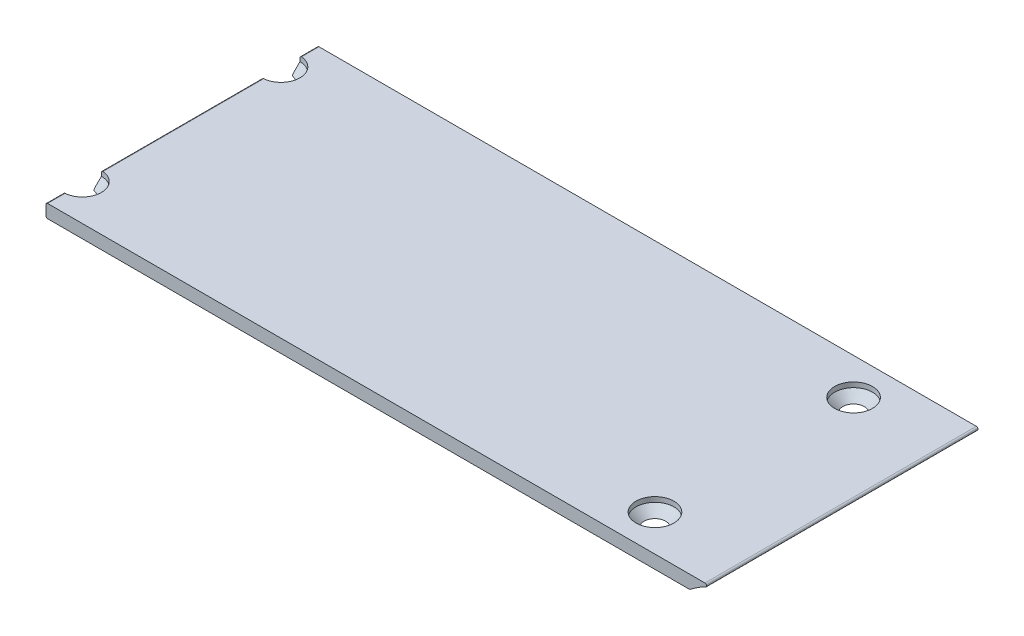
ISO-10303-21;
HEADER;
FILE_DESCRIPTION(('STEP AP214'),'2;1');
FILE_NAME('part.step','',(''),(''),'','','');
FILE_SCHEMA(('AUTOMOTIVE_DESIGN { 1 0 10303 214 1 1 1 1 }'));
ENDSEC;
DATA;
#1=APPLICATION_CONTEXT('core data for automotive mechanical design processes');
#2=APPLICATION_PROTOCOL_DEFINITION('international standard','automotive_design',2000,#1);
#3=PRODUCT_CONTEXT('',#1,'mechanical');
#4=PRODUCT('Part','Part','',(#3));
#5=PRODUCT_RELATED_PRODUCT_CATEGORY('part','',(#4));
#6=PRODUCT_DEFINITION_FORMATION('','',#4);
#7=PRODUCT_DEFINITION_CONTEXT('part definition',#1,'design');
#8=PRODUCT_DEFINITION('design','',#6,#7);
#9=PRODUCT_DEFINITION_SHAPE('','',#8);
#10=(LENGTH_UNIT() NAMED_UNIT(*) SI_UNIT(.MILLI.,.METRE.));
#11=(NAMED_UNIT(*) PLANE_ANGLE_UNIT() SI_UNIT($,.RADIAN.));
#12=(NAMED_UNIT(*) SI_UNIT($,.STERADIAN.) SOLID_ANGLE_UNIT());
#13=UNCERTAINTY_MEASURE_WITH_UNIT(LENGTH_MEASURE(1.E-05),#10,'distance_accuracy_value','');
#14=(GEOMETRIC_REPRESENTATION_CONTEXT(3) GLOBAL_UNCERTAINTY_ASSIGNED_CONTEXT((#13)) GLOBAL_UNIT_ASSIGNED_CONTEXT((#10,
#11,#12)) REPRESENTATION_CONTEXT('',''));
#15=CARTESIAN_POINT('',(0.,0.,0.));
#16=DIRECTION('',(0.,0.,1.));
#17=DIRECTION('',(1.,0.,0.));
#18=AXIS2_PLACEMENT_3D('',#15,#16,#17);
#19=CARTESIAN_POINT('',(225.,23.,-49.5));
#20=DIRECTION('',(-1.,0.,0.));
#21=DIRECTION('',(0.,0.,1.));
#22=AXIS2_PLACEMENT_3D('',#19,#20,#21);
#23=PLANE('',#22);
#24=DIRECTION('',(0.,0.707106781186548,0.707106781186547));
#25=VECTOR('',#24,1.);
#26=CARTESIAN_POINT('',(225.,15.765,-19.5));
#27=LINE('',#26,#25);
#28=CARTESIAN_POINT('',(225.,19.4999999999993,-15.7650000000002));
#29=VERTEX_POINT('',#28);
#30=CARTESIAN_POINT('',(225.,21.5,-13.765));
#31=VERTEX_POINT('',#30);
#32=EDGE_CURVE('E318',#29,#31,#27,.T.);
#33=ORIENTED_EDGE('',*,*,#32,.F.);
#34=DIRECTION('',(0.,0.,1.));
#35=VECTOR('',#34,1.);
#36=CARTESIAN_POINT('',(225.,19.4999999999996,-49.5));
#37=LINE('',#36,#35);
#38=CARTESIAN_POINT('',(225.,19.4999999999996,-8.5));
#39=VERTEX_POINT('',#38);
#40=EDGE_CURVE('E376',#29,#39,#37,.T.);
#41=ORIENTED_EDGE('',*,*,#40,.T.);
#42=DIRECTION('',(0.,-1.,0.));
#43=VECTOR('',#42,1.);
#44=CARTESIAN_POINT('',(225.,23.,-8.5));
#45=LINE('',#44,#43);
#46=CARTESIAN_POINT('',(225.,22.5,-8.5));
#47=VERTEX_POINT('',#46);
#48=EDGE_CURVE('E351',#47,#39,#45,.T.);
#49=ORIENTED_EDGE('',*,*,#48,.F.);
#50=DIRECTION('',(0.,0.,1.));
#51=VECTOR('',#50,1.);
#52=CARTESIAN_POINT('',(225.,22.5,-49.5));
#53=LINE('',#52,#51);
#54=CARTESIAN_POINT('',(225.,22.5,-13.765));
#55=VERTEX_POINT('',#54);
#56=EDGE_CURVE('E379',#47,#55,#53,.F.);
#57=ORIENTED_EDGE('',*,*,#56,.T.);
#58=DIRECTION('',(0.,1.,0.));
#59=VECTOR('',#58,1.);
#60=CARTESIAN_POINT('',(225.,23.,-13.765));
#61=LINE('',#60,#59);
#62=EDGE_CURVE('E349',#31,#55,#61,.T.);
#63=ORIENTED_EDGE('',*,*,#62,.F.);
#64=EDGE_LOOP('',(#33,#41,#49,#57,#63));
#65=FACE_BOUND('',#64,.T.);
#66=ADVANCED_FACE('F39',(#65),#23,.T.);
#67=CARTESIAN_POINT('',(225.5,22.5,-49.5));
#68=DIRECTION('',(0.,0.,1.));
#69=DIRECTION('',(1.,0.,0.));
#70=AXIS2_PLACEMENT_3D('',#67,#68,#69);
#71=CYLINDRICAL_SURFACE('',#70,0.5);
#72=CARTESIAN_POINT('',(225.,22.5,-13.765));
#73=CARTESIAN_POINT('',(224.999976111889,22.5281270241259,-13.7650058933718));
#74=CARTESIAN_POINT('',(225.002371960446,22.556246933712,-13.7650000985351));
#75=CARTESIAN_POINT('',(225.011826932998,22.6116702744218,-13.7650086911855));
#76=CARTESIAN_POINT('',(225.018882460735,22.6389743182435,-13.7650230631178));
#77=CARTESIAN_POINT('',(225.03748559768,22.6920222990551,-13.7651154452753));
#78=CARTESIAN_POINT('',(225.049035381988,22.7177654736426,-13.7651934863348));
#79=CARTESIAN_POINT('',(225.076288829427,22.7669429593841,-13.7654911959646));
#80=CARTESIAN_POINT('',(225.091991765805,22.7903776735078,-13.7657108397658));
#81=CARTESIAN_POINT('',(225.127101175343,22.8342695592799,-13.7663818409362));
#82=CARTESIAN_POINT('',(225.146506433251,22.8547277040867,-13.7668331223544));
#83=CARTESIAN_POINT('',(225.188472933217,22.8920972800601,-13.7680594283539));
#84=CARTESIAN_POINT('',(225.211034691092,22.9090081304163,-13.7688345058893));
#85=CARTESIAN_POINT('',(225.258632974092,22.9387817108491,-13.7707853832107));
#86=CARTESIAN_POINT('',(225.283666630535,22.9516490625717,-13.7719607222782));
#87=CARTESIAN_POINT('',(225.335509264018,22.9729984387523,-13.7747637106296));
#88=CARTESIAN_POINT('',(225.362317286307,22.9814828003144,-13.7763911181476));
#89=CARTESIAN_POINT('',(225.407737733062,22.9917659002081,-13.779483792947));
#90=CARTESIAN_POINT('',(225.426077913602,22.994853101934,-13.7808198640753));
#91=CARTESIAN_POINT('',(225.462945725978,22.9989699440721,-13.7836855266412));
#92=CARTESIAN_POINT('',(225.481473047125,23.000002564215,-13.7852148343995));
#93=CARTESIAN_POINT('',(225.5,23.,-13.786837565761));
#94=B_SPLINE_CURVE_WITH_KNOTS('',3,(#72,#73,#74,#75,#76,#77,#78,#79,#80,#81,#82,#83,#84,#85,#86,
#87,#88,#89,#90,#91,#92,#93),.UNSPECIFIED.,.F.,.F.,(4,2,2,2,2,2,2,2,2,2,4),(0.,
0.0842690311517414,0.168473100829007,0.252717973809997,0.336948114676777,0.421150655196376,
0.5053669717384,0.589486677461794,0.673561482340993,0.729391894278504,0.785141276964552),.UNSPECIFIED.);
#95=CARTESIAN_POINT('',(225.5,23.,-13.786837565761));
#96=VERTEX_POINT('',#95);
#97=EDGE_CURVE('E343',#55,#96,#94,.T.);
#98=ORIENTED_EDGE('',*,*,#97,.F.);
#99=ORIENTED_EDGE('',*,*,#56,.F.);
#100=CARTESIAN_POINT('',(225.5,22.5,-8.5));
#101=DIRECTION('',(0.,0.,1.));
#102=DIRECTION('',(1.,0.,0.));
#103=AXIS2_PLACEMENT_3D('',#100,#101,#102);
#104=CIRCLE('',#103,0.5);
#105=CARTESIAN_POINT('',(225.5,23.,-8.5));
#106=VERTEX_POINT('',#105);
#107=EDGE_CURVE('E374',#106,#47,#104,.T.);
#108=ORIENTED_EDGE('',*,*,#107,.F.);
#109=DIRECTION('',(0.,0.,1.));
#110=VECTOR('',#109,1.);
#111=CARTESIAN_POINT('',(225.5,23.,-49.5));
#112=LINE('',#111,#110);
#113=EDGE_CURVE('E365',#96,#106,#112,.T.);
#114=ORIENTED_EDGE('',*,*,#113,.F.);
#115=EDGE_LOOP('',(#98,#99,#108,#114));
#116=FACE_BOUND('',#115,.T.);
#117=ADVANCED_FACE('F281',(#116),#71,.T.);
#118=CARTESIAN_POINT('',(225.5,19.4999999999996,-49.5));
#119=DIRECTION('',(0.,0.,1.));
#120=DIRECTION('',(1.,0.,0.));
#121=AXIS2_PLACEMENT_3D('',#118,#119,#120);
#122=CYLINDRICAL_SURFACE('',#121,0.5);
#123=CARTESIAN_POINT('',(225.002526422812,19.5501999999996,-23.285199156872));
#124=CARTESIAN_POINT('',(225.000564653077,19.5306837247009,-23.2656828056493));
#125=CARTESIAN_POINT('',(224.999743406715,19.5111223870039,-23.2461222284875));
#126=CARTESIAN_POINT('',(225.000398976851,19.4720030494911,-23.2070032070346));
#127=CARTESIAN_POINT('',(225.001877756651,19.4524450667949,-23.1874447788333));
#128=CARTESIAN_POINT('',(225.009825989489,19.3937144747553,-23.1287066790372));
#129=CARTESIAN_POINT('',(225.019833415117,19.354741026895,-23.0897199236154));
#130=CARTESIAN_POINT('',(225.046432568021,19.2871812312316,-23.0218946279302));
#131=CARTESIAN_POINT('',(225.061108363734,19.2581856697311,-22.9926996941433));
#132=CARTESIAN_POINT('',(225.096805786974,19.2024707982455,-22.93615751171));
#133=CARTESIAN_POINT('',(225.11780758487,19.1757447051482,-22.908804811526));
#134=CARTESIAN_POINT('',(225.160537905986,19.1319502493724,-22.8631751857383));
#135=CARTESIAN_POINT('',(225.180848433837,19.1141135932447,-22.8443084851037));
#136=CARTESIAN_POINT('',(225.225328719884,19.0812905891293,-22.8087083521058));
#137=CARTESIAN_POINT('',(225.249495827681,19.0663022990164,-22.7919734687729));
#138=CARTESIAN_POINT('',(225.29620124717,19.0428308841404,-22.7644919913127));
#139=CARTESIAN_POINT('',(225.318074856484,19.0336448917804,-22.7532193477425));
#140=CARTESIAN_POINT('',(225.363816952495,19.0183006870287,-22.7329812121385));
#141=CARTESIAN_POINT('',(225.387680007914,19.0121345278856,-22.7240096946372));
#142=CARTESIAN_POINT('',(225.434383705236,19.0038197606829,-22.7096379980003));
#143=CARTESIAN_POINT('',(225.457076386205,19.0013226866008,-22.7039651027765));
#144=CARTESIAN_POINT('',(225.503243925115,18.9994647849746,-22.6951657556668));
#145=CARTESIAN_POINT('',(225.52672339428,19.0001277735784,-22.6920588487729));
#146=CARTESIAN_POINT('',(225.5502,19.0025264228118,-22.6904321491617));
#147=B_SPLINE_CURVE_WITH_KNOTS('',3,(#123,#124,#125,#126,#127,#128,#129,#130,#131,#132,#133,
#134,#135,#136,#137,#138,#139,#140,#141,#142,#143,#144,#145,#146),.UNSPECIFIED.,.F.,.F.,(4,2,2,
2,2,2,2,2,2,2,2,4),(0.,0.0829495843265982,0.165970013303469,0.333085915997442,0.463694854194704,
0.593898569508003,0.692447709658665,0.790929412223857,0.869426002124149,0.947714901650061,
1.01793790593085,1.0886909865257),.UNSPECIFIED.);
#148=CARTESIAN_POINT('',(224.999999999999,19.4999999999996,-23.2349999999996));
#149=VERTEX_POINT('',#148);
#150=CARTESIAN_POINT('',(225.5,18.9999999999996,-22.6961265619492));
#151=VERTEX_POINT('',#150);
#152=EDGE_CURVE('E11',#149,#151,#147,.T.);
#153=ORIENTED_EDGE('',*,*,#152,.F.);
#154=CARTESIAN_POINT('',(224.999999999999,19.4999999999996,-75.7650000000004));
#155=VERTEX_POINT('',#154);
#156=EDGE_CURVE('E314',#155,#149,#37,.T.);
#157=ORIENTED_EDGE('',*,*,#156,.F.);
#158=CARTESIAN_POINT('',(225.002526422812,19.5501999999996,-75.714800843128));
#159=CARTESIAN_POINT('',(225.000564653077,19.5306837247009,-75.7343171943507));
#160=CARTESIAN_POINT('',(224.999743406715,19.5111223870039,-75.7538777715125));
#161=CARTESIAN_POINT('',(225.000398976851,19.4720030494911,-75.7929967929654));
#162=CARTESIAN_POINT('',(225.001877756651,19.4524450667949,-75.8125552211667));
#163=CARTESIAN_POINT('',(225.009825989489,19.3937144747553,-75.8712933209628));
#164=CARTESIAN_POINT('',(225.019833415117,19.354741026895,-75.9102800763846));
#165=CARTESIAN_POINT('',(225.046432568021,19.2871812312316,-75.9781053720698));
#166=CARTESIAN_POINT('',(225.061108363734,19.2581856697311,-76.0073003058567));
#167=CARTESIAN_POINT('',(225.096805786974,19.2024707982455,-76.06384248829));
#168=CARTESIAN_POINT('',(225.11780758487,19.1757447051482,-76.091195188474));
#169=CARTESIAN_POINT('',(225.160537905986,19.1319502493724,-76.1368248142617));
#170=CARTESIAN_POINT('',(225.180848433837,19.1141135932447,-76.1556915148963));
#171=CARTESIAN_POINT('',(225.225328719884,19.0812905891293,-76.1912916478942));
#172=CARTESIAN_POINT('',(225.249495827681,19.0663022990164,-76.2080265312271));
#173=CARTESIAN_POINT('',(225.29620124717,19.0428308841404,-76.2355080086873));
#174=CARTESIAN_POINT('',(225.318074856484,19.0336448917804,-76.2467806522575));
#175=CARTESIAN_POINT('',(225.363816952495,19.0183006870287,-76.2670187878615));
#176=CARTESIAN_POINT('',(225.387680007914,19.0121345278856,-76.2759903053628));
#177=CARTESIAN_POINT('',(225.434383705236,19.0038197606829,-76.2903620019998));
#178=CARTESIAN_POINT('',(225.457076386205,19.0013226866008,-76.2960348972235));
#179=CARTESIAN_POINT('',(225.503243925115,18.9994647849746,-76.3048342443332));
#180=CARTESIAN_POINT('',(225.52672339428,19.0001277735784,-76.3079411512271));
#181=CARTESIAN_POINT('',(225.5502,19.0025264228118,-76.3095678508383));
#182=B_SPLINE_CURVE_WITH_KNOTS('',3,(#158,#159,#160,#161,#162,#163,#164,#165,#166,#167,#168,
#169,#170,#171,#172,#173,#174,#175,#176,#177,#178,#179,#180,#181),.UNSPECIFIED.,.F.,.F.,(4,2,2,
2,2,2,2,2,2,2,2,4),(0.,0.0829495843265958,0.165970013303472,0.33308591599744,0.463694854194704,
0.593898569508001,0.692447709658643,0.790929412223859,0.869426002124153,0.947714901650063,
1.01793790593085,1.0886909865257),.UNSPECIFIED.);
#183=CARTESIAN_POINT('',(225.5,18.9999999999996,-76.3038734380508));
#184=VERTEX_POINT('',#183);
#185=EDGE_CURVE('E264',#155,#184,#182,.T.);
#186=ORIENTED_EDGE('',*,*,#185,.T.);
#187=DIRECTION('',(0.,0.,1.));
#188=VECTOR('',#187,1.);
#189=CARTESIAN_POINT('',(225.5,18.9999999999996,-49.5));
#190=LINE('',#189,#188);
#191=EDGE_CURVE('E386',#151,#184,#190,.F.);
#192=ORIENTED_EDGE('',*,*,#191,.F.);
#193=EDGE_LOOP('',(#153,#157,#186,#192));
#194=FACE_BOUND('',#193,.T.);
#195=ADVANCED_FACE('F291',(#194),#122,.T.);
#196=DIRECTION('',(0.,-0.707106781186548,0.707106781186547));
#197=VECTOR('',#196,1.);
#198=CARTESIAN_POINT('',(225.,15.765,-19.5));
#199=LINE('',#198,#197);
#200=CARTESIAN_POINT('',(225.,21.5,-25.235));
#201=VERTEX_POINT('',#200);
#202=EDGE_CURVE('E311',#201,#149,#199,.T.);
#203=ORIENTED_EDGE('',*,*,#202,.F.);
#204=DIRECTION('',(0.,1.,0.));
#205=VECTOR('',#204,1.);
#206=CARTESIAN_POINT('',(225.,23.,-25.235));
#207=LINE('',#206,#205);
#208=CARTESIAN_POINT('',(225.,22.5,-25.235));
#209=VERTEX_POINT('',#208);
#210=EDGE_CURVE('E312',#209,#201,#207,.F.);
#211=ORIENTED_EDGE('',*,*,#210,.F.);
#212=CARTESIAN_POINT('',(225.,22.5,-73.765));
#213=VERTEX_POINT('',#212);
#214=EDGE_CURVE('E378',#209,#213,#53,.F.);
#215=ORIENTED_EDGE('',*,*,#214,.T.);
#216=DIRECTION('',(0.,1.,0.));
#217=VECTOR('',#216,1.);
#218=CARTESIAN_POINT('',(225.,23.,-73.765));
#219=LINE('',#218,#217);
#220=CARTESIAN_POINT('',(225.,21.5,-73.765));
#221=VERTEX_POINT('',#220);
#222=EDGE_CURVE('E208',#213,#221,#219,.F.);
#223=ORIENTED_EDGE('',*,*,#222,.T.);
#224=DIRECTION('',(0.,-0.707106781186548,-0.707106781186547));
#225=VECTOR('',#224,1.);
#226=CARTESIAN_POINT('',(225.,15.765,-79.5));
#227=LINE('',#226,#225);
#228=EDGE_CURVE('E172',#221,#155,#227,.T.);
#229=ORIENTED_EDGE('',*,*,#228,.T.);
#230=ORIENTED_EDGE('',*,*,#156,.T.);
#231=EDGE_LOOP('',(#203,#211,#215,#223,#229,#230));
#232=FACE_BOUND('',#231,.T.);
#233=ADVANCED_FACE('F284',(#232),#23,.T.);
#234=CARTESIAN_POINT('',(225.,23.,-49.5));
#235=DIRECTION('',(0.,1.,0.));
#236=DIRECTION('',(-1.,0.,0.));
#237=AXIS2_PLACEMENT_3D('',#234,#235,#236);
#238=PLANE('',#237);
#239=CARTESIAN_POINT('',(398.,23.,-19.5));
#240=DIRECTION('',(0.,1.,0.));
#241=DIRECTION('',(0.,0.,1.));
#242=AXIS2_PLACEMENT_3D('',#239,#240,#241);
#243=CIRCLE('',#242,5.73499999999999);
#244=CARTESIAN_POINT('',(398.,23.,-13.765));
#245=VERTEX_POINT('',#244);
#246=EDGE_CURVE('E430',#245,#245,#243,.T.);
#247=ORIENTED_EDGE('',*,*,#246,.F.);
#248=EDGE_LOOP('',(#247));
#249=FACE_BOUND('',#248,.T.);
#250=CARTESIAN_POINT('',(225.,23.,-19.5));
#251=DIRECTION('',(0.,1.,0.));
#252=DIRECTION('',(0.,0.,1.));
#253=AXIS2_PLACEMENT_3D('',#250,#251,#252);
#254=CIRCLE('',#253,5.73499999999999);
#255=CARTESIAN_POINT('',(225.5,23.,-25.213162434239));
#256=VERTEX_POINT('',#255);
#257=EDGE_CURVE('E416',#96,#256,#254,.T.);
#258=ORIENTED_EDGE('',*,*,#257,.F.);
#259=ORIENTED_EDGE('',*,*,#113,.T.);
#260=DIRECTION('',(-1.,0.,0.));
#261=VECTOR('',#260,1.);
#262=CARTESIAN_POINT('',(225.,23.,-8.5));
#263=LINE('',#262,#261);
#264=CARTESIAN_POINT('',(424.102752641149,23.0000000000001,-8.5));
#265=VERTEX_POINT('',#264);
#266=EDGE_CURVE('E360',#265,#106,#263,.T.);
#267=ORIENTED_EDGE('',*,*,#266,.F.);
#268=DIRECTION('',(0.,0.,1.));
#269=VECTOR('',#268,1.);
#270=CARTESIAN_POINT('',(424.102752641149,23.0000000000001,-49.5));
#271=LINE('',#270,#269);
#272=CARTESIAN_POINT('',(424.102752641149,23.0000000000001,-90.5));
#273=VERTEX_POINT('',#272);
#274=EDGE_CURVE('E363',#265,#273,#271,.F.);
#275=ORIENTED_EDGE('',*,*,#274,.T.);
#276=DIRECTION('',(-1.,0.,0.));
#277=VECTOR('',#276,1.);
#278=CARTESIAN_POINT('',(225.,23.,-90.5));
#279=LINE('',#278,#277);
#280=CARTESIAN_POINT('',(225.5,23.,-90.5));
#281=VERTEX_POINT('',#280);
#282=EDGE_CURVE('E237',#273,#281,#279,.T.);
#283=ORIENTED_EDGE('',*,*,#282,.T.);
#284=DIRECTION('',(0.,0.,-1.));
#285=VECTOR('',#284,1.);
#286=CARTESIAN_POINT('',(225.5,23.,-49.5));
#287=LINE('',#286,#285);
#288=CARTESIAN_POINT('',(225.5,23.,-85.213162434239));
#289=VERTEX_POINT('',#288);
#290=EDGE_CURVE('E239',#289,#281,#287,.T.);
#291=ORIENTED_EDGE('',*,*,#290,.F.);
#292=CARTESIAN_POINT('',(225.,23.,-79.5));
#293=DIRECTION('',(0.,-1.,0.));
#294=DIRECTION('',(0.,0.,-1.));
#295=AXIS2_PLACEMENT_3D('',#292,#293,#294);
#296=CIRCLE('',#295,5.73499999999999);
#297=CARTESIAN_POINT('',(225.5,23.,-73.786837565761));
#298=VERTEX_POINT('',#297);
#299=EDGE_CURVE('E177',#289,#298,#296,.T.);
#300=ORIENTED_EDGE('',*,*,#299,.T.);
#301=EDGE_CURVE('E366',#298,#256,#112,.T.);
#302=ORIENTED_EDGE('',*,*,#301,.T.);
#303=EDGE_LOOP('',(#258,#259,#267,#275,#283,#291,#300,#302));
#304=FACE_BOUND('',#303,.T.);
#305=CARTESIAN_POINT('',(398.,23.,-79.5));
#306=DIRECTION('',(0.,-1.,0.));
#307=DIRECTION('',(0.,0.,-1.));
#308=AXIS2_PLACEMENT_3D('',#305,#306,#307);
#309=CIRCLE('',#308,5.73499999999999);
#310=CARTESIAN_POINT('',(398.,23.,-85.235));
#311=VERTEX_POINT('',#310);
#312=EDGE_CURVE('E439',#311,#311,#309,.T.);
#313=ORIENTED_EDGE('',*,*,#312,.T.);
#314=EDGE_LOOP('',(#313));
#315=FACE_BOUND('',#314,.T.);
#316=ADVANCED_FACE('F298',(#249,#304,#315),#238,.T.);
#317=CARTESIAN_POINT('',(435.,0.,-49.5));
#318=DIRECTION('',(0.,0.,1.));
#319=DIRECTION('',(1.,0.,0.));
#320=AXIS2_PLACEMENT_3D('',#317,#318,#319);
#321=CYLINDRICAL_SURFACE('',#320,24.5);
#322=DIRECTION('',(0.,0.,1.));
#323=VECTOR('',#322,1.);
#324=CARTESIAN_POINT('',(419.668401909782,19.11,-49.5));
#325=LINE('',#324,#323);
#326=CARTESIAN_POINT('',(419.668401909782,19.11,-8.5));
#327=VERTEX_POINT('',#326);
#328=CARTESIAN_POINT('',(419.668401909782,19.11,-90.5));
#329=VERTEX_POINT('',#328);
#330=EDGE_CURVE('E382',#327,#329,#325,.F.);
#331=ORIENTED_EDGE('',*,*,#330,.T.);
#332=CARTESIAN_POINT('',(435.,0.,-90.5));
#333=DIRECTION('',(0.,0.,-1.));
#334=DIRECTION('',(1.,0.,0.));
#335=AXIS2_PLACEMENT_3D('',#332,#333,#334);
#336=CIRCLE('',#335,24.5);
#337=CARTESIAN_POINT('',(424.320697588326,22.0500000000001,-90.5));
#338=VERTEX_POINT('',#337);
#339=EDGE_CURVE('E234',#329,#338,#336,.T.);
#340=ORIENTED_EDGE('',*,*,#339,.T.);
#341=DIRECTION('',(0.,0.,1.));
#342=VECTOR('',#341,1.);
#343=CARTESIAN_POINT('',(424.320697588326,22.0500000000001,-49.5));
#344=LINE('',#343,#342);
#345=CARTESIAN_POINT('',(424.320697588326,22.0500000000001,-8.5));
#346=VERTEX_POINT('',#345);
#347=EDGE_CURVE('E384',#338,#346,#344,.T.);
#348=ORIENTED_EDGE('',*,*,#347,.T.);
#349=CARTESIAN_POINT('',(435.,0.,-8.5));
#350=DIRECTION('',(0.,0.,-1.));
#351=DIRECTION('',(1.,0.,0.));
#352=AXIS2_PLACEMENT_3D('',#349,#350,#351);
#353=CIRCLE('',#352,24.5);
#354=EDGE_CURVE('E357',#327,#346,#353,.T.);
#355=ORIENTED_EDGE('',*,*,#354,.F.);
#356=EDGE_LOOP('',(#331,#340,#348,#355));
#357=FACE_BOUND('',#356,.T.);
#358=ADVANCED_FACE('F304',(#357),#321,.F.);
#359=CARTESIAN_POINT('',(419.532291701742,19.,-49.5));
#360=DIRECTION('',(0.,-1.,0.));
#361=DIRECTION('',(1.,0.,0.));
#362=AXIS2_PLACEMENT_3D('',#359,#360,#361);
#363=PLANE('',#362);
#364=CARTESIAN_POINT('',(398.,19.,-19.5));
#365=DIRECTION('',(0.,-1.,0.));
#366=DIRECTION('',(1.,0.,0.));
#367=AXIS2_PLACEMENT_3D('',#364,#365,#366);
#368=CIRCLE('',#367,3.23499999999994);
#369=CARTESIAN_POINT('',(401.235,19.,-19.5));
#370=VERTEX_POINT('',#369);
#371=EDGE_CURVE('E44',#370,#370,#368,.T.);
#372=ORIENTED_EDGE('',*,*,#371,.F.);
#373=EDGE_LOOP('',(#372));
#374=FACE_BOUND('',#373,.T.);
#375=CARTESIAN_POINT('',(225.,18.9999999999996,-19.5));
#376=DIRECTION('',(0.,-1.,0.));
#377=DIRECTION('',(1.,0.,0.));
#378=AXIS2_PLACEMENT_3D('',#375,#376,#377);
#379=CIRCLE('',#378,3.23499999999957);
#380=CARTESIAN_POINT('',(225.5,18.9999999999996,-16.3038734380508));
#381=VERTEX_POINT('',#380);
#382=EDGE_CURVE('E55',#151,#381,#379,.T.);
#383=ORIENTED_EDGE('',*,*,#382,.F.);
#384=ORIENTED_EDGE('',*,*,#191,.T.);
#385=CARTESIAN_POINT('',(225.,18.9999999999996,-79.5));
#386=DIRECTION('',(0.,1.,0.));
#387=DIRECTION('',(1.,0.,0.));
#388=AXIS2_PLACEMENT_3D('',#385,#386,#387);
#389=CIRCLE('',#388,3.23499999999957);
#390=CARTESIAN_POINT('',(225.5,18.9999999999996,-82.6961265619492));
#391=VERTEX_POINT('',#390);
#392=EDGE_CURVE('E176',#184,#391,#389,.T.);
#393=ORIENTED_EDGE('',*,*,#392,.T.);
#394=DIRECTION('',(0.,0.,-1.));
#395=VECTOR('',#394,1.);
#396=CARTESIAN_POINT('',(225.5,18.9999999999996,-49.5));
#397=LINE('',#396,#395);
#398=CARTESIAN_POINT('',(225.5,18.9999999999996,-90.5));
#399=VERTEX_POINT('',#398);
#400=EDGE_CURVE('E255',#399,#391,#397,.F.);
#401=ORIENTED_EDGE('',*,*,#400,.F.);
#402=DIRECTION('',(1.,0.,0.));
#403=VECTOR('',#402,1.);
#404=CARTESIAN_POINT('',(419.532291701742,19.,-90.5));
#405=LINE('',#404,#403);
#406=CARTESIAN_POINT('',(419.355512152838,19.,-90.5));
#407=VERTEX_POINT('',#406);
#408=EDGE_CURVE('E231',#399,#407,#405,.T.);
#409=ORIENTED_EDGE('',*,*,#408,.T.);
#410=DIRECTION('',(0.,0.,1.));
#411=VECTOR('',#410,1.);
#412=CARTESIAN_POINT('',(419.355512152838,19.,-49.5));
#413=LINE('',#412,#411);
#414=CARTESIAN_POINT('',(419.355512152838,19.,-8.5));
#415=VERTEX_POINT('',#414);
#416=EDGE_CURVE('E390',#407,#415,#413,.T.);
#417=ORIENTED_EDGE('',*,*,#416,.T.);
#418=DIRECTION('',(1.,0.,0.));
#419=VECTOR('',#418,1.);
#420=CARTESIAN_POINT('',(419.532291701742,19.,-8.5));
#421=LINE('',#420,#419);
#422=CARTESIAN_POINT('',(225.5,18.9999999999996,-8.5));
#423=VERTEX_POINT('',#422);
#424=EDGE_CURVE('E354',#423,#415,#421,.T.);
#425=ORIENTED_EDGE('',*,*,#424,.F.);
#426=EDGE_CURVE('E387',#423,#381,#190,.F.);
#427=ORIENTED_EDGE('',*,*,#426,.T.);
#428=EDGE_LOOP('',(#383,#384,#393,#401,#409,#417,#425,#427));
#429=FACE_BOUND('',#428,.T.);
#430=CARTESIAN_POINT('',(398.,19.,-79.5));
#431=DIRECTION('',(0.,1.,0.));
#432=DIRECTION('',(1.,0.,0.));
#433=AXIS2_PLACEMENT_3D('',#430,#431,#432);
#434=CIRCLE('',#433,3.23499999999994);
#435=CARTESIAN_POINT('',(401.235,19.,-79.5));
#436=VERTEX_POINT('',#435);
#437=EDGE_CURVE('E432',#436,#436,#434,.T.);
#438=ORIENTED_EDGE('',*,*,#437,.T.);
#439=EDGE_LOOP('',(#438));
#440=FACE_BOUND('',#439,.T.);
#441=ADVANCED_FACE('F526',(#374,#429,#440),#363,.T.);
#442=CARTESIAN_POINT('',(435.,0.,-8.5));
#443=DIRECTION('',(0.,0.,1.));
#444=DIRECTION('',(1.,0.,0.));
#445=AXIS2_PLACEMENT_3D('',#442,#443,#444);
#446=PLANE('',#445);
#447=ORIENTED_EDGE('',*,*,#266,.T.);
#448=ORIENTED_EDGE('',*,*,#107,.T.);
#449=ORIENTED_EDGE('',*,*,#48,.T.);
#450=CARTESIAN_POINT('',(225.5,19.4999999999996,-8.5));
#451=DIRECTION('',(0.,0.,1.));
#452=DIRECTION('',(1.,0.,0.));
#453=AXIS2_PLACEMENT_3D('',#450,#451,#452);
#454=CIRCLE('',#453,0.5);
#455=EDGE_CURVE('E369',#39,#423,#454,.T.);
#456=ORIENTED_EDGE('',*,*,#455,.T.);
#457=ORIENTED_EDGE('',*,*,#424,.T.);
#458=CARTESIAN_POINT('',(419.355512152838,19.5,-8.5));
#459=DIRECTION('',(0.,0.,1.));
#460=DIRECTION('',(1.,0.,0.));
#461=AXIS2_PLACEMENT_3D('',#458,#459,#460);
#462=CIRCLE('',#461,0.5);
#463=EDGE_CURVE('E371',#415,#327,#462,.T.);
#464=ORIENTED_EDGE('',*,*,#463,.T.);
#465=ORIENTED_EDGE('',*,*,#354,.T.);
#466=CARTESIAN_POINT('',(424.102752641149,22.5,-8.5));
#467=DIRECTION('',(0.,0.,1.));
#468=DIRECTION('',(1.,0.,0.));
#469=AXIS2_PLACEMENT_3D('',#466,#467,#468);
#470=CIRCLE('',#469,0.5);
#471=EDGE_CURVE('E63',#346,#265,#470,.T.);
#472=ORIENTED_EDGE('',*,*,#471,.T.);
#473=EDGE_LOOP('',(#447,#448,#449,#456,#457,#464,#465,#472));
#474=FACE_BOUND('',#473,.T.);
#475=ADVANCED_FACE('F410',(#474),#446,.T.);
#476=CARTESIAN_POINT('',(225.5,23.,-25.213162434239));
#477=CARTESIAN_POINT('',(225.47198948981,23.0000245800375,-25.2156218282848));
#478=CARTESIAN_POINT('',(225.443964426867,22.9976475663107,-25.2178591541508));
#479=CARTESIAN_POINT('',(225.388690455363,22.9882508167163,-25.2218779882086));
#480=CARTESIAN_POINT('',(225.36144099801,22.9812344531948,-25.2236598261912));
#481=CARTESIAN_POINT('',(225.308464627873,22.9627134831437,-25.2267605355825));
#482=CARTESIAN_POINT('',(225.282738639935,22.9512061818478,-25.2280791281184));
#483=CARTESIAN_POINT('',(225.233572848711,22.9240340275891,-25.2302943363909));
#484=CARTESIAN_POINT('',(225.210132555469,22.9083700683287,-25.2311910427203));
#485=CARTESIAN_POINT('',(225.166250394567,22.8733599218072,-25.2326318742266));
#486=CARTESIAN_POINT('',(225.145802632343,22.854021150665,-25.2331766999546));
#487=CARTESIAN_POINT('',(225.108428858547,22.8121840210353,-25.2340054451725));
#488=CARTESIAN_POINT('',(225.091503589202,22.7896849983171,-25.234289309718));
#489=CARTESIAN_POINT('',(225.061645767858,22.7421457925394,-25.2346882068935));
#490=CARTESIAN_POINT('',(225.048717445474,22.7171029545515,-25.2348030611547));
#491=CARTESIAN_POINT('',(225.027249121449,22.6652087188528,-25.2349453708333));
#492=CARTESIAN_POINT('',(225.018706631516,22.6383583564402,-25.234972875854));
#493=CARTESIAN_POINT('',(225.008330507337,22.5927924927522,-25.2349954477094));
#494=CARTESIAN_POINT('',(225.005208604504,22.5743599536835,-25.2349982872587));
#495=CARTESIAN_POINT('',(225.001043516479,22.5372874926583,-25.235000009976));
#496=CARTESIAN_POINT('',(224.999997450315,22.5186478942758,-25.2349988986334));
#497=CARTESIAN_POINT('',(225.,22.5,-25.235));
#498=B_SPLINE_CURVE_WITH_KNOTS('',3,(#476,#477,#478,#479,#480,#481,#482,#483,#484,#485,#486,
#487,#488,#489,#490,#491,#492,#493,#494,#495,#496,#497),.UNSPECIFIED.,.F.,.F.,(4,2,2,2,2,2,2,2,
2,2,4),(0.,0.0842466434316219,0.168432115150683,0.252668179828577,0.336886147979862,
0.420935927415868,0.505003399183274,0.589159529979407,0.673267862067994,0.729243844277357,
0.785142085159217),.UNSPECIFIED.);
#499=EDGE_CURVE('E317',#256,#209,#498,.T.);
#500=ORIENTED_EDGE('',*,*,#499,.F.);
#501=ORIENTED_EDGE('',*,*,#301,.F.);
#502=CARTESIAN_POINT('',(225.5,23.,-73.786837565761));
#503=CARTESIAN_POINT('',(225.47198948981,23.0000245800375,-73.7843781717152));
#504=CARTESIAN_POINT('',(225.443964426867,22.9976475663107,-73.7821408458493));
#505=CARTESIAN_POINT('',(225.388690455363,22.9882508167163,-73.7781220117915));
#506=CARTESIAN_POINT('',(225.36144099801,22.9812344531948,-73.7763401738088));
#507=CARTESIAN_POINT('',(225.308464627873,22.9627134831436,-73.7732394644175));
#508=CARTESIAN_POINT('',(225.282738639935,22.9512061818478,-73.7719208718816));
#509=CARTESIAN_POINT('',(225.233572848711,22.924034027589,-73.7697056636091));
#510=CARTESIAN_POINT('',(225.210132555469,22.9083700683287,-73.7688089572797));
#511=CARTESIAN_POINT('',(225.166250394567,22.8733599218072,-73.7673681257734));
#512=CARTESIAN_POINT('',(225.145802632343,22.854021150665,-73.7668233000454));
#513=CARTESIAN_POINT('',(225.108428858547,22.8121840210353,-73.7659945548275));
#514=CARTESIAN_POINT('',(225.091503589202,22.7896849983171,-73.765710690282));
#515=CARTESIAN_POINT('',(225.061645767858,22.7421457925394,-73.7653117931064));
#516=CARTESIAN_POINT('',(225.048717445474,22.7171029545515,-73.7651969388452));
#517=CARTESIAN_POINT('',(225.027249121449,22.6652087188528,-73.7650546291668));
#518=CARTESIAN_POINT('',(225.018706631516,22.6383583564402,-73.765027124146));
#519=CARTESIAN_POINT('',(225.008330507337,22.5927924927522,-73.7650045522906));
#520=CARTESIAN_POINT('',(225.005208604504,22.5743599536835,-73.7650017127413));
#521=CARTESIAN_POINT('',(225.001043516479,22.5372874926583,-73.764999990024));
#522=CARTESIAN_POINT('',(224.999997450315,22.5186478942758,-73.7650011013666));
#523=CARTESIAN_POINT('',(225.,22.5,-73.765));
#524=B_SPLINE_CURVE_WITH_KNOTS('',3,(#502,#503,#504,#505,#506,#507,#508,#509,#510,#511,#512,
#513,#514,#515,#516,#517,#518,#519,#520,#521,#522,#523),.UNSPECIFIED.,.F.,.F.,(4,2,2,2,2,2,2,2,
2,2,4),(0.,0.0842466434316208,0.168432115150683,0.252668179828638,0.336886147979861,
0.420935927415868,0.505003399183273,0.589159529979407,0.673267862067994,0.729243844277356,
0.785142085159217),.UNSPECIFIED.);
#525=EDGE_CURVE('E195',#298,#213,#524,.T.);
#526=ORIENTED_EDGE('',*,*,#525,.T.);
#527=ORIENTED_EDGE('',*,*,#214,.F.);
#528=EDGE_LOOP('',(#500,#501,#526,#527));
#529=FACE_BOUND('',#528,.T.);
#530=ADVANCED_FACE('F294',(#529),#71,.T.);
#531=CARTESIAN_POINT('',(424.102752641149,22.5,-49.5));
#532=DIRECTION('',(0.,0.,1.));
#533=DIRECTION('',(1.,0.,0.));
#534=AXIS2_PLACEMENT_3D('',#531,#532,#533);
#535=CYLINDRICAL_SURFACE('',#534,0.5);
#536=ORIENTED_EDGE('',*,*,#347,.F.);
#537=CARTESIAN_POINT('',(424.102752641149,22.5,-90.5));
#538=DIRECTION('',(0.,0.,1.));
#539=DIRECTION('',(1.,0.,0.));
#540=AXIS2_PLACEMENT_3D('',#537,#538,#539);
#541=CIRCLE('',#540,0.5);
#542=EDGE_CURVE('E247',#338,#273,#541,.T.);
#543=ORIENTED_EDGE('',*,*,#542,.T.);
#544=ORIENTED_EDGE('',*,*,#274,.F.);
#545=ORIENTED_EDGE('',*,*,#471,.F.);
#546=EDGE_LOOP('',(#536,#543,#544,#545));
#547=FACE_BOUND('',#546,.T.);
#548=ADVANCED_FACE('F501',(#547),#535,.T.);
#549=CARTESIAN_POINT('',(419.355512152838,19.5,-49.5));
#550=DIRECTION('',(0.,0.,1.));
#551=DIRECTION('',(1.,0.,0.));
#552=AXIS2_PLACEMENT_3D('',#549,#550,#551);
#553=CYLINDRICAL_SURFACE('',#552,0.5);
#554=ORIENTED_EDGE('',*,*,#416,.F.);
#555=CARTESIAN_POINT('',(419.355512152838,19.5,-90.5));
#556=DIRECTION('',(0.,0.,1.));
#557=DIRECTION('',(1.,0.,0.));
#558=AXIS2_PLACEMENT_3D('',#555,#556,#557);
#559=CIRCLE('',#558,0.5);
#560=EDGE_CURVE('E244',#407,#329,#559,.T.);
#561=ORIENTED_EDGE('',*,*,#560,.T.);
#562=ORIENTED_EDGE('',*,*,#330,.F.);
#563=ORIENTED_EDGE('',*,*,#463,.F.);
#564=EDGE_LOOP('',(#554,#561,#562,#563));
#565=FACE_BOUND('',#564,.T.);
#566=ADVANCED_FACE('F496',(#565),#553,.T.);
#567=CARTESIAN_POINT('',(225.5502,19.0025264228118,-16.3095678508383));
#568=CARTESIAN_POINT('',(225.526087216052,19.0000597275336,-16.3078990245377));
#569=CARTESIAN_POINT('',(225.501971888189,18.9994281876423,-16.3046660735523));
#570=CARTESIAN_POINT('',(225.454600300031,19.0015151519186,-16.2954841032464));
#571=CARTESIAN_POINT('',(225.43133874508,19.0042071387777,-16.2895568183387));
#572=CARTESIAN_POINT('',(225.386210271837,19.0125779195783,-16.2753834343752));
#573=CARTESIAN_POINT('',(225.364338983462,19.0182467766418,-16.267145092057));
#574=CARTESIAN_POINT('',(225.322254430778,19.0321341870713,-16.2487237096464));
#575=CARTESIAN_POINT('',(225.302044892922,19.0403582833822,-16.2385364605355));
#576=CARTESIAN_POINT('',(225.256140789725,19.0624975246198,-16.212347327863));
#577=CARTESIAN_POINT('',(225.231329601783,19.077384734954,-16.195616725264));
#578=CARTESIAN_POINT('',(225.185640556452,19.1101645212762,-16.1599045146475));
#579=CARTESIAN_POINT('',(225.164768694517,19.1280616010908,-16.1409195460054));
#580=CARTESIAN_POINT('',(225.120972018029,19.172006279098,-16.0950422937783));
#581=CARTESIAN_POINT('',(225.099476510038,19.1988440491789,-16.067544809442));
#582=CARTESIAN_POINT('',(225.062952319362,19.2548277158212,-16.0106889720366));
#583=CARTESIAN_POINT('',(225.04793213118,19.2839765851944,-15.981328232237));
#584=CARTESIAN_POINT('',(225.023759040511,19.3442127490651,-15.9208444815341));
#585=CARTESIAN_POINT('',(225.014739143435,19.3753282367649,-15.8896971602787));
#586=CARTESIAN_POINT('',(225.002818648436,19.4381045993366,-15.8268911666289));
#587=CARTESIAN_POINT('',(224.999908727463,19.4697645688586,-15.7952333476861));
#588=CARTESIAN_POINT('',(225.000049966186,19.5176897510575,-15.7473113211899));
#589=CARTESIAN_POINT('',(225.00089338421,19.533968812791,-15.7310333139247));
#590=CARTESIAN_POINT('',(225.002526422812,19.5501999999996,-15.714800843128));
#591=B_SPLINE_CURVE_WITH_KNOTS('',3,(#567,#568,#569,#570,#571,#572,#573,#574,#575,#576,#577,
#578,#579,#580,#581,#582,#583,#584,#585,#586,#587,#588,#589,#590),.UNSPECIFIED.,.F.,.F.,(4,2,2,
2,2,2,2,2,2,2,2,4),(0.,0.0726625084962667,0.144748995318829,0.21659637077699,0.288600702101643,
0.3883235152908,0.488196898775598,0.619575148482717,0.751125223214365,0.885501921552365,
1.01967342859991,1.08872455492887),.UNSPECIFIED.);
#592=EDGE_CURVE('E49',#381,#29,#591,.T.);
#593=ORIENTED_EDGE('',*,*,#592,.F.);
#594=ORIENTED_EDGE('',*,*,#426,.F.);
#595=ORIENTED_EDGE('',*,*,#455,.F.);
#596=ORIENTED_EDGE('',*,*,#40,.F.);
#597=EDGE_LOOP('',(#593,#594,#595,#596));
#598=FACE_BOUND('',#597,.T.);
#599=ADVANCED_FACE('F41',(#598),#122,.T.);
#600=CARTESIAN_POINT('',(225.,21.5,-19.5));
#601=DIRECTION('',(0.,1.,0.));
#602=DIRECTION('',(0.,0.,1.));
#603=AXIS2_PLACEMENT_3D('',#600,#601,#602);
#604=CONICAL_SURFACE('',#603,5.73499999999999,0.785398163397448);
#605=ORIENTED_EDGE('',*,*,#202,.T.);
#606=ORIENTED_EDGE('',*,*,#152,.T.);
#607=ORIENTED_EDGE('',*,*,#382,.T.);
#608=ORIENTED_EDGE('',*,*,#592,.T.);
#609=ORIENTED_EDGE('',*,*,#32,.T.);
#610=CARTESIAN_POINT('',(225.,21.5,-19.5));
#611=DIRECTION('',(0.,1.,0.));
#612=DIRECTION('',(0.,0.,1.));
#613=AXIS2_PLACEMENT_3D('',#610,#611,#612);
#614=CIRCLE('',#613,5.73499999999999);
#615=EDGE_CURVE('E422',#31,#201,#614,.T.);
#616=ORIENTED_EDGE('',*,*,#615,.T.);
#617=EDGE_LOOP('',(#605,#606,#607,#608,#609,#616));
#618=FACE_BOUND('',#617,.T.);
#619=ADVANCED_FACE('F338',(#618),#604,.F.);
#620=CARTESIAN_POINT('',(225.,23.,-19.5));
#621=DIRECTION('',(0.,1.,0.));
#622=DIRECTION('',(0.,0.,1.));
#623=AXIS2_PLACEMENT_3D('',#620,#621,#622);
#624=CYLINDRICAL_SURFACE('',#623,5.73499999999999);
#625=ORIENTED_EDGE('',*,*,#62,.T.);
#626=ORIENTED_EDGE('',*,*,#97,.T.);
#627=ORIENTED_EDGE('',*,*,#257,.T.);
#628=ORIENTED_EDGE('',*,*,#499,.T.);
#629=ORIENTED_EDGE('',*,*,#210,.T.);
#630=ORIENTED_EDGE('',*,*,#615,.F.);
#631=EDGE_LOOP('',(#625,#626,#627,#628,#629,#630));
#632=FACE_BOUND('',#631,.T.);
#633=ADVANCED_FACE('F332',(#632),#624,.F.);
#634=CARTESIAN_POINT('',(398.,21.5,-19.5));
#635=DIRECTION('',(0.,1.,0.));
#636=DIRECTION('',(0.,0.,1.));
#637=AXIS2_PLACEMENT_3D('',#634,#635,#636);
#638=CONICAL_SURFACE('',#637,5.73499999999999,0.785398163397443);
#639=ORIENTED_EDGE('',*,*,#371,.T.);
#640=EDGE_LOOP('',(#639));
#641=FACE_BOUND('',#640,.T.);
#642=CARTESIAN_POINT('',(398.,21.5,-19.5));
#643=DIRECTION('',(0.,1.,0.));
#644=DIRECTION('',(0.,0.,1.));
#645=AXIS2_PLACEMENT_3D('',#642,#643,#644);
#646=CIRCLE('',#645,5.73499999999999);
#647=CARTESIAN_POINT('',(398.,21.5,-13.765));
#648=VERTEX_POINT('',#647);
#649=EDGE_CURVE('E426',#648,#648,#646,.T.);
#650=ORIENTED_EDGE('',*,*,#649,.T.);
#651=EDGE_LOOP('',(#650));
#652=FACE_BOUND('',#651,.T.);
#653=ADVANCED_FACE('F337',(#641,#652),#638,.F.);
#654=CARTESIAN_POINT('',(398.,23.,-19.5));
#655=DIRECTION('',(0.,1.,0.));
#656=DIRECTION('',(0.,0.,1.));
#657=AXIS2_PLACEMENT_3D('',#654,#655,#656);
#658=CYLINDRICAL_SURFACE('',#657,5.73499999999999);
#659=ORIENTED_EDGE('',*,*,#649,.F.);
#660=EDGE_LOOP('',(#659));
#661=FACE_BOUND('',#660,.T.);
#662=ORIENTED_EDGE('',*,*,#246,.T.);
#663=EDGE_LOOP('',(#662));
#664=FACE_BOUND('',#663,.T.);
#665=ADVANCED_FACE('F491',(#661,#664),#658,.F.);
#666=CARTESIAN_POINT('',(225.,23.,-49.5));
#667=DIRECTION('',(-1.,0.,0.));
#668=DIRECTION('',(0.,0.,-1.));
#669=AXIS2_PLACEMENT_3D('',#666,#667,#668);
#670=PLANE('',#669);
#671=DIRECTION('',(0.,0.707106781186548,-0.707106781186547));
#672=VECTOR('',#671,1.);
#673=CARTESIAN_POINT('',(225.,15.765,-79.5));
#674=LINE('',#673,#672);
#675=CARTESIAN_POINT('',(225.,19.4999999999993,-83.2349999999998));
#676=VERTEX_POINT('',#675);
#677=CARTESIAN_POINT('',(225.,21.5,-85.235));
#678=VERTEX_POINT('',#677);
#679=EDGE_CURVE('E169',#676,#678,#674,.T.);
#680=ORIENTED_EDGE('',*,*,#679,.T.);
#681=DIRECTION('',(0.,1.,0.));
#682=VECTOR('',#681,1.);
#683=CARTESIAN_POINT('',(225.,23.,-85.235));
#684=LINE('',#683,#682);
#685=CARTESIAN_POINT('',(225.,22.5,-85.235));
#686=VERTEX_POINT('',#685);
#687=EDGE_CURVE('E180',#678,#686,#684,.T.);
#688=ORIENTED_EDGE('',*,*,#687,.T.);
#689=DIRECTION('',(0.,0.,-1.));
#690=VECTOR('',#689,1.);
#691=CARTESIAN_POINT('',(225.,22.5,-49.5));
#692=LINE('',#691,#690);
#693=CARTESIAN_POINT('',(225.,22.5,-90.5));
#694=VERTEX_POINT('',#693);
#695=EDGE_CURVE('E253',#694,#686,#692,.F.);
#696=ORIENTED_EDGE('',*,*,#695,.F.);
#697=DIRECTION('',(0.,-1.,0.));
#698=VECTOR('',#697,1.);
#699=CARTESIAN_POINT('',(225.,23.,-90.5));
#700=LINE('',#699,#698);
#701=CARTESIAN_POINT('',(225.,19.4999999999996,-90.5));
#702=VERTEX_POINT('',#701);
#703=EDGE_CURVE('E187',#694,#702,#700,.T.);
#704=ORIENTED_EDGE('',*,*,#703,.T.);
#705=DIRECTION('',(0.,0.,-1.));
#706=VECTOR('',#705,1.);
#707=CARTESIAN_POINT('',(225.,19.4999999999996,-49.5));
#708=LINE('',#707,#706);
#709=EDGE_CURVE('E193',#676,#702,#708,.T.);
#710=ORIENTED_EDGE('',*,*,#709,.F.);
#711=EDGE_LOOP('',(#680,#688,#696,#704,#710));
#712=FACE_BOUND('',#711,.T.);
#713=ADVANCED_FACE('F190',(#712),#670,.T.);
#714=CARTESIAN_POINT('',(225.5,22.5,-49.5));
#715=DIRECTION('',(0.,0.,-1.));
#716=DIRECTION('',(1.,0.,0.));
#717=AXIS2_PLACEMENT_3D('',#714,#715,#716);
#718=CYLINDRICAL_SURFACE('',#717,0.5);
#719=CARTESIAN_POINT('',(225.,22.5,-85.235));
#720=CARTESIAN_POINT('',(224.999976111889,22.5281270241259,-85.2349941066282));
#721=CARTESIAN_POINT('',(225.002371960446,22.556246933712,-85.2349999014649));
#722=CARTESIAN_POINT('',(225.011826932998,22.6116702744218,-85.2349913088145));
#723=CARTESIAN_POINT('',(225.018882460735,22.6389743182435,-85.2349769368822));
#724=CARTESIAN_POINT('',(225.03748559768,22.6920222990551,-85.2348845547247));
#725=CARTESIAN_POINT('',(225.049035381988,22.7177654736426,-85.2348065136652));
#726=CARTESIAN_POINT('',(225.076288829427,22.7669429593841,-85.2345088040354));
#727=CARTESIAN_POINT('',(225.091991765805,22.7903776735078,-85.2342891602342));
#728=CARTESIAN_POINT('',(225.127101175343,22.8342695592799,-85.2336181590638));
#729=CARTESIAN_POINT('',(225.146506433251,22.8547277040867,-85.2331668776456));
#730=CARTESIAN_POINT('',(225.188472933216,22.8920972800601,-85.2319405716461));
#731=CARTESIAN_POINT('',(225.211034691092,22.9090081304163,-85.2311654941107));
#732=CARTESIAN_POINT('',(225.258632974092,22.9387817108491,-85.2292146167893));
#733=CARTESIAN_POINT('',(225.283666630535,22.9516490625717,-85.2280392777218));
#734=CARTESIAN_POINT('',(225.335509264018,22.9729984387523,-85.2252362893704));
#735=CARTESIAN_POINT('',(225.362317286307,22.9814828003144,-85.2236088818524));
#736=CARTESIAN_POINT('',(225.407737733062,22.9917659002081,-85.220516207053));
#737=CARTESIAN_POINT('',(225.426077913602,22.994853101934,-85.2191801359247));
#738=CARTESIAN_POINT('',(225.462945725978,22.9989699440721,-85.2163144733588));
#739=CARTESIAN_POINT('',(225.481473047125,23.000002564215,-85.2147851656005));
#740=CARTESIAN_POINT('',(225.5,23.,-85.213162434239));
#741=B_SPLINE_CURVE_WITH_KNOTS('',3,(#719,#720,#721,#722,#723,#724,#725,#726,#727,#728,#729,
#730,#731,#732,#733,#734,#735,#736,#737,#738,#739,#740),.UNSPECIFIED.,.F.,.F.,(4,2,2,2,2,2,2,2,
2,2,4),(0.,0.0842690311517414,0.168473100829007,0.252717973809997,0.336948114676777,
0.421150655196344,0.505366971738401,0.589486677461796,0.673561482340994,0.729391894278505,
0.785141276964553),.UNSPECIFIED.);
#742=EDGE_CURVE('E183',#686,#289,#741,.T.);
#743=ORIENTED_EDGE('',*,*,#742,.T.);
#744=ORIENTED_EDGE('',*,*,#290,.T.);
#745=CARTESIAN_POINT('',(225.5,22.5,-90.5));
#746=DIRECTION('',(0.,0.,1.));
#747=DIRECTION('',(1.,0.,0.));
#748=AXIS2_PLACEMENT_3D('',#745,#746,#747);
#749=CIRCLE('',#748,0.5);
#750=EDGE_CURVE('E250',#281,#694,#749,.T.);
#751=ORIENTED_EDGE('',*,*,#750,.T.);
#752=ORIENTED_EDGE('',*,*,#695,.T.);
#753=EDGE_LOOP('',(#743,#744,#751,#752));
#754=FACE_BOUND('',#753,.T.);
#755=ADVANCED_FACE('F213',(#754),#718,.T.);
#756=CARTESIAN_POINT('',(435.,0.,-90.5));
#757=DIRECTION('',(0.,0.,-1.));
#758=DIRECTION('',(1.,0.,0.));
#759=AXIS2_PLACEMENT_3D('',#756,#757,#758);
#760=PLANE('',#759);
#761=ORIENTED_EDGE('',*,*,#282,.F.);
#762=ORIENTED_EDGE('',*,*,#542,.F.);
#763=ORIENTED_EDGE('',*,*,#339,.F.);
#764=ORIENTED_EDGE('',*,*,#560,.F.);
#765=ORIENTED_EDGE('',*,*,#408,.F.);
#766=CARTESIAN_POINT('',(225.5,19.4999999999996,-90.5));
#767=DIRECTION('',(0.,0.,1.));
#768=DIRECTION('',(1.,0.,0.));
#769=AXIS2_PLACEMENT_3D('',#766,#767,#768);
#770=CIRCLE('',#769,0.5);
#771=EDGE_CURVE('E242',#702,#399,#770,.T.);
#772=ORIENTED_EDGE('',*,*,#771,.F.);
#773=ORIENTED_EDGE('',*,*,#703,.F.);
#774=ORIENTED_EDGE('',*,*,#750,.F.);
#775=EDGE_LOOP('',(#761,#762,#763,#764,#765,#772,#773,#774));
#776=FACE_BOUND('',#775,.T.);
#777=ADVANCED_FACE('F218',(#776),#760,.T.);
#778=CARTESIAN_POINT('',(225.5,19.4999999999996,-49.5));
#779=DIRECTION('',(0.,0.,-1.));
#780=DIRECTION('',(1.,0.,0.));
#781=AXIS2_PLACEMENT_3D('',#778,#779,#780);
#782=CYLINDRICAL_SURFACE('',#781,0.5);
#783=CARTESIAN_POINT('',(225.5502,19.0025264228118,-82.6904321491617));
#784=CARTESIAN_POINT('',(225.526087216052,19.0000597275336,-82.6921009754624));
#785=CARTESIAN_POINT('',(225.501971888189,18.9994281876423,-82.6953339264477));
#786=CARTESIAN_POINT('',(225.454600300031,19.0015151519186,-82.7045158967536));
#787=CARTESIAN_POINT('',(225.43133874508,19.0042071387777,-82.7104431816613));
#788=CARTESIAN_POINT('',(225.386210271837,19.0125779195783,-82.7246165656248));
#789=CARTESIAN_POINT('',(225.364338983462,19.0182467766418,-82.7328549079431));
#790=CARTESIAN_POINT('',(225.322254430778,19.0321341870713,-82.7512762903536));
#791=CARTESIAN_POINT('',(225.302044892922,19.0403582833822,-82.7614635394645));
#792=CARTESIAN_POINT('',(225.256140789725,19.0624975246198,-82.787652672137));
#793=CARTESIAN_POINT('',(225.231329601783,19.077384734954,-82.8043832747361));
#794=CARTESIAN_POINT('',(225.185640556452,19.1101645212762,-82.8400954853525));
#795=CARTESIAN_POINT('',(225.164768694517,19.1280616010908,-82.8590804539947));
#796=CARTESIAN_POINT('',(225.120972018029,19.1720062790981,-82.9049577062217));
#797=CARTESIAN_POINT('',(225.099476510038,19.1988440491789,-82.932455190558));
#798=CARTESIAN_POINT('',(225.062952319362,19.2548277158212,-82.9893110279634));
#799=CARTESIAN_POINT('',(225.04793213118,19.2839765851944,-83.018671767763));
#800=CARTESIAN_POINT('',(225.023759040511,19.3442127490651,-83.0791555184659));
#801=CARTESIAN_POINT('',(225.014739143435,19.3753282367648,-83.1103028397213));
#802=CARTESIAN_POINT('',(225.002818648436,19.4381045993366,-83.1731088333711));
#803=CARTESIAN_POINT('',(224.999908727463,19.4697645688586,-83.2047666523139));
#804=CARTESIAN_POINT('',(225.000049966186,19.5176897510575,-83.2526886788102));
#805=CARTESIAN_POINT('',(225.00089338421,19.533968812791,-83.2689666860753));
#806=CARTESIAN_POINT('',(225.002526422812,19.5501999999996,-83.285199156872));
#807=B_SPLINE_CURVE_WITH_KNOTS('',3,(#783,#784,#785,#786,#787,#788,#789,#790,#791,#792,#793,
#794,#795,#796,#797,#798,#799,#800,#801,#802,#803,#804,#805,#806),.UNSPECIFIED.,.F.,.F.,(4,2,2,
2,2,2,2,2,2,2,2,4),(0.,0.0726625084962676,0.144748995318827,0.216596370776991,0.288600702101641,
0.388323515290807,0.488196898775601,0.619575148482723,0.751125223214363,0.885501921552358,
1.01967342859991,1.08872455492886),.UNSPECIFIED.);
#808=EDGE_CURVE('E258',#391,#676,#807,.T.);
#809=ORIENTED_EDGE('',*,*,#808,.T.);
#810=ORIENTED_EDGE('',*,*,#709,.T.);
#811=ORIENTED_EDGE('',*,*,#771,.T.);
#812=ORIENTED_EDGE('',*,*,#400,.T.);
#813=EDGE_LOOP('',(#809,#810,#811,#812));
#814=FACE_BOUND('',#813,.T.);
#815=ADVANCED_FACE('F221',(#814),#782,.T.);
#816=CARTESIAN_POINT('',(225.,21.5,-79.5));
#817=DIRECTION('',(0.,1.,0.));
#818=DIRECTION('',(0.,0.,-1.));
#819=AXIS2_PLACEMENT_3D('',#816,#817,#818);
#820=CONICAL_SURFACE('',#819,5.73499999999999,0.785398163397448);
#821=ORIENTED_EDGE('',*,*,#228,.F.);
#822=CARTESIAN_POINT('',(225.,21.5,-79.5));
#823=DIRECTION('',(0.,-1.,0.));
#824=DIRECTION('',(0.,0.,-1.));
#825=AXIS2_PLACEMENT_3D('',#822,#823,#824);
#826=CIRCLE('',#825,5.73499999999999);
#827=EDGE_CURVE('E165',#678,#221,#826,.T.);
#828=ORIENTED_EDGE('',*,*,#827,.F.);
#829=ORIENTED_EDGE('',*,*,#679,.F.);
#830=ORIENTED_EDGE('',*,*,#808,.F.);
#831=ORIENTED_EDGE('',*,*,#392,.F.);
#832=ORIENTED_EDGE('',*,*,#185,.F.);
#833=EDGE_LOOP('',(#821,#828,#829,#830,#831,#832));
#834=FACE_BOUND('',#833,.T.);
#835=ADVANCED_FACE('F167',(#834),#820,.F.);
#836=CARTESIAN_POINT('',(225.,23.,-79.5));
#837=DIRECTION('',(0.,1.,0.));
#838=DIRECTION('',(0.,0.,-1.));
#839=AXIS2_PLACEMENT_3D('',#836,#837,#838);
#840=CYLINDRICAL_SURFACE('',#839,5.73499999999999);
#841=ORIENTED_EDGE('',*,*,#687,.F.);
#842=ORIENTED_EDGE('',*,*,#827,.T.);
#843=ORIENTED_EDGE('',*,*,#222,.F.);
#844=ORIENTED_EDGE('',*,*,#525,.F.);
#845=ORIENTED_EDGE('',*,*,#299,.F.);
#846=ORIENTED_EDGE('',*,*,#742,.F.);
#847=EDGE_LOOP('',(#841,#842,#843,#844,#845,#846));
#848=FACE_BOUND('',#847,.T.);
#849=ADVANCED_FACE('F181',(#848),#840,.F.);
#850=CARTESIAN_POINT('',(398.,21.5,-79.5));
#851=DIRECTION('',(0.,1.,0.));
#852=DIRECTION('',(0.,0.,-1.));
#853=AXIS2_PLACEMENT_3D('',#850,#851,#852);
#854=CONICAL_SURFACE('',#853,5.73499999999999,0.785398163397443);
#855=ORIENTED_EDGE('',*,*,#437,.F.);
#856=EDGE_LOOP('',(#855));
#857=FACE_BOUND('',#856,.T.);
#858=CARTESIAN_POINT('',(398.,21.5,-79.5));
#859=DIRECTION('',(0.,-1.,0.));
#860=DIRECTION('',(0.,0.,-1.));
#861=AXIS2_PLACEMENT_3D('',#858,#859,#860);
#862=CIRCLE('',#861,5.73499999999999);
#863=CARTESIAN_POINT('',(398.,21.5,-85.235));
#864=VERTEX_POINT('',#863);
#865=EDGE_CURVE('E434',#864,#864,#862,.T.);
#866=ORIENTED_EDGE('',*,*,#865,.F.);
#867=EDGE_LOOP('',(#866));
#868=FACE_BOUND('',#867,.T.);
#869=ADVANCED_FACE('F449',(#857,#868),#854,.F.);
#870=CARTESIAN_POINT('',(398.,23.,-79.5));
#871=DIRECTION('',(0.,1.,0.));
#872=DIRECTION('',(0.,0.,-1.));
#873=AXIS2_PLACEMENT_3D('',#870,#871,#872);
#874=CYLINDRICAL_SURFACE('',#873,5.73499999999999);
#875=ORIENTED_EDGE('',*,*,#865,.T.);
#876=EDGE_LOOP('',(#875));
#877=FACE_BOUND('',#876,.T.);
#878=ORIENTED_EDGE('',*,*,#312,.F.);
#879=EDGE_LOOP('',(#878));
#880=FACE_BOUND('',#879,.T.);
#881=ADVANCED_FACE('F447',(#877,#880),#874,.F.);
#882=CLOSED_SHELL('',(#66,#117,#195,#233,#316,#358,#441,#475,#530,#548,#566,#599,#619,#633,#653,
#665,#713,#755,#777,#815,#835,#849,#869,#881));
#883=MANIFOLD_SOLID_BREP('B2',#882);
#884=ADVANCED_BREP_SHAPE_REPRESENTATION('',(#18,#883),#14);
#885=SHAPE_DEFINITION_REPRESENTATION(#9,#884);
ENDSEC;
END-ISO-10303-21;
